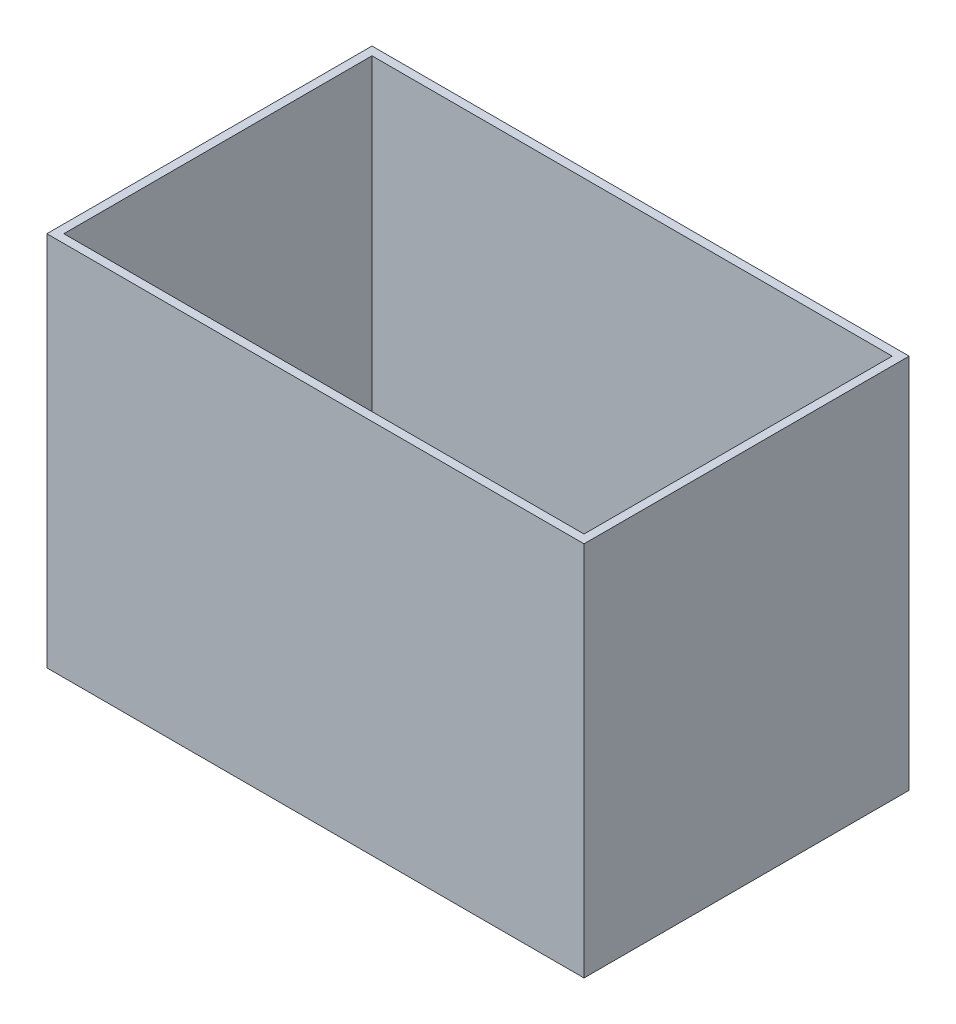
ISO-10303-21;
HEADER;
FILE_DESCRIPTION(('STEP AP214'),'2;1');
FILE_NAME('part.step','',(''),(''),'','','');
FILE_SCHEMA(('AUTOMOTIVE_DESIGN { 1 0 10303 214 1 1 1 1 }'));
ENDSEC;
DATA;
#1=APPLICATION_CONTEXT('core data for automotive mechanical design processes');
#2=APPLICATION_PROTOCOL_DEFINITION('international standard','automotive_design',2000,#1);
#3=PRODUCT_CONTEXT('',#1,'mechanical');
#4=PRODUCT('Part','Part','',(#3));
#5=PRODUCT_RELATED_PRODUCT_CATEGORY('part','',(#4));
#6=PRODUCT_DEFINITION_FORMATION('','',#4);
#7=PRODUCT_DEFINITION_CONTEXT('part definition',#1,'design');
#8=PRODUCT_DEFINITION('design','',#6,#7);
#9=PRODUCT_DEFINITION_SHAPE('','',#8);
#10=(LENGTH_UNIT() NAMED_UNIT(*) SI_UNIT(.MILLI.,.METRE.));
#11=(NAMED_UNIT(*) PLANE_ANGLE_UNIT() SI_UNIT($,.RADIAN.));
#12=(NAMED_UNIT(*) SI_UNIT($,.STERADIAN.) SOLID_ANGLE_UNIT());
#13=UNCERTAINTY_MEASURE_WITH_UNIT(LENGTH_MEASURE(1.E-05),#10,'distance_accuracy_value','');
#14=(GEOMETRIC_REPRESENTATION_CONTEXT(3) GLOBAL_UNCERTAINTY_ASSIGNED_CONTEXT((#13)) GLOBAL_UNIT_ASSIGNED_CONTEXT((#10,
#11,#12)) REPRESENTATION_CONTEXT('',''));
#15=CARTESIAN_POINT('',(0.,0.,0.));
#16=DIRECTION('',(0.,0.,1.));
#17=DIRECTION('',(1.,0.,0.));
#18=AXIS2_PLACEMENT_3D('',#15,#16,#17);
#19=CARTESIAN_POINT('',(0.,6.,0.));
#20=DIRECTION('',(1.,0.,0.));
#21=DIRECTION('',(0.,0.,-1.));
#22=AXIS2_PLACEMENT_3D('',#19,#20,#21);
#23=PLANE('',#22);
#24=DIRECTION('',(0.,0.,1.));
#25=VECTOR('',#24,1.);
#26=CARTESIAN_POINT('',(0.,0.,0.));
#27=LINE('',#26,#25);
#28=CARTESIAN_POINT('',(0.,0.,0.));
#29=VERTEX_POINT('',#28);
#30=CARTESIAN_POINT('',(0.,0.,230.));
#31=VERTEX_POINT('',#30);
#32=EDGE_CURVE('E144',#29,#31,#27,.T.);
#33=ORIENTED_EDGE('',*,*,#32,.T.);
#34=DIRECTION('',(0.,-1.,0.));
#35=VECTOR('',#34,1.);
#36=CARTESIAN_POINT('',(0.,6.,230.));
#37=LINE('',#36,#35);
#38=CARTESIAN_POINT('',(0.,266.,230.));
#39=VERTEX_POINT('',#38);
#40=EDGE_CURVE('E11',#39,#31,#37,.T.);
#41=ORIENTED_EDGE('',*,*,#40,.F.);
#42=DIRECTION('',(0.,0.,1.));
#43=VECTOR('',#42,1.);
#44=CARTESIAN_POINT('',(0.,266.,230.));
#45=LINE('',#44,#43);
#46=CARTESIAN_POINT('',(0.,266.,0.));
#47=VERTEX_POINT('',#46);
#48=EDGE_CURVE('E111',#47,#39,#45,.T.);
#49=ORIENTED_EDGE('',*,*,#48,.F.);
#50=DIRECTION('',(0.,-1.,0.));
#51=VECTOR('',#50,1.);
#52=CARTESIAN_POINT('',(0.,6.,0.));
#53=LINE('',#52,#51);
#54=EDGE_CURVE('E153',#47,#29,#53,.T.);
#55=ORIENTED_EDGE('',*,*,#54,.T.);
#56=EDGE_LOOP('',(#33,#41,#49,#55));
#57=FACE_BOUND('',#56,.T.);
#58=ADVANCED_FACE('F33',(#57),#23,.F.);
#59=CARTESIAN_POINT('',(0.,6.,230.));
#60=DIRECTION('',(0.,0.,-1.));
#61=DIRECTION('',(-1.,0.,0.));
#62=AXIS2_PLACEMENT_3D('',#59,#60,#61);
#63=PLANE('',#62);
#64=DIRECTION('',(1.,0.,0.));
#65=VECTOR('',#64,1.);
#66=CARTESIAN_POINT('',(0.,0.,230.));
#67=LINE('',#66,#65);
#68=CARTESIAN_POINT('',(380.,0.,230.));
#69=VERTEX_POINT('',#68);
#70=EDGE_CURVE('E147',#31,#69,#67,.T.);
#71=ORIENTED_EDGE('',*,*,#70,.T.);
#72=DIRECTION('',(0.,-1.,0.));
#73=VECTOR('',#72,1.);
#74=CARTESIAN_POINT('',(380.,6.,230.));
#75=LINE('',#74,#73);
#76=CARTESIAN_POINT('',(380.,266.,230.));
#77=VERTEX_POINT('',#76);
#78=EDGE_CURVE('E40',#77,#69,#75,.T.);
#79=ORIENTED_EDGE('',*,*,#78,.F.);
#80=DIRECTION('',(1.,0.,0.));
#81=VECTOR('',#80,1.);
#82=CARTESIAN_POINT('',(0.,266.,230.));
#83=LINE('',#82,#81);
#84=EDGE_CURVE('E135',#39,#77,#83,.T.);
#85=ORIENTED_EDGE('',*,*,#84,.F.);
#86=ORIENTED_EDGE('',*,*,#40,.T.);
#87=EDGE_LOOP('',(#71,#79,#85,#86));
#88=FACE_BOUND('',#87,.T.);
#89=ADVANCED_FACE('F175',(#88),#63,.F.);
#90=CARTESIAN_POINT('',(380.,6.,0.));
#91=DIRECTION('',(-1.,0.,0.));
#92=DIRECTION('',(0.,0.,1.));
#93=AXIS2_PLACEMENT_3D('',#90,#91,#92);
#94=PLANE('',#93);
#95=DIRECTION('',(0.,0.,-1.));
#96=VECTOR('',#95,1.);
#97=CARTESIAN_POINT('',(380.,0.,0.));
#98=LINE('',#97,#96);
#99=CARTESIAN_POINT('',(380.,0.,0.));
#100=VERTEX_POINT('',#99);
#101=EDGE_CURVE('E149',#69,#100,#98,.T.);
#102=ORIENTED_EDGE('',*,*,#101,.T.);
#103=DIRECTION('',(0.,-1.,0.));
#104=VECTOR('',#103,1.);
#105=CARTESIAN_POINT('',(380.,6.,0.));
#106=LINE('',#105,#104);
#107=CARTESIAN_POINT('',(380.,266.,0.));
#108=VERTEX_POINT('',#107);
#109=EDGE_CURVE('E156',#108,#100,#106,.T.);
#110=ORIENTED_EDGE('',*,*,#109,.F.);
#111=DIRECTION('',(0.,0.,-1.));
#112=VECTOR('',#111,1.);
#113=CARTESIAN_POINT('',(380.,266.,230.));
#114=LINE('',#113,#112);
#115=EDGE_CURVE('E138',#77,#108,#114,.T.);
#116=ORIENTED_EDGE('',*,*,#115,.F.);
#117=ORIENTED_EDGE('',*,*,#78,.T.);
#118=EDGE_LOOP('',(#102,#110,#116,#117));
#119=FACE_BOUND('',#118,.T.);
#120=ADVANCED_FACE('F162',(#119),#94,.F.);
#121=CARTESIAN_POINT('',(0.,6.,0.));
#122=DIRECTION('',(0.,0.,1.));
#123=DIRECTION('',(1.,0.,0.));
#124=AXIS2_PLACEMENT_3D('',#121,#122,#123);
#125=PLANE('',#124);
#126=DIRECTION('',(-1.,0.,0.));
#127=VECTOR('',#126,1.);
#128=CARTESIAN_POINT('',(0.,0.,0.));
#129=LINE('',#128,#127);
#130=EDGE_CURVE('E151',#100,#29,#129,.T.);
#131=ORIENTED_EDGE('',*,*,#130,.T.);
#132=ORIENTED_EDGE('',*,*,#54,.F.);
#133=DIRECTION('',(-1.,0.,0.));
#134=VECTOR('',#133,1.);
#135=CARTESIAN_POINT('',(0.,266.,0.));
#136=LINE('',#135,#134);
#137=EDGE_CURVE('E141',#108,#47,#136,.T.);
#138=ORIENTED_EDGE('',*,*,#137,.F.);
#139=ORIENTED_EDGE('',*,*,#109,.T.);
#140=EDGE_LOOP('',(#131,#132,#138,#139));
#141=FACE_BOUND('',#140,.T.);
#142=ADVANCED_FACE('F170',(#141),#125,.F.);
#143=CARTESIAN_POINT('',(0.,0.,0.));
#144=DIRECTION('',(0.,1.,0.));
#145=DIRECTION('',(0.,0.,1.));
#146=AXIS2_PLACEMENT_3D('',#143,#144,#145);
#147=PLANE('',#146);
#148=ORIENTED_EDGE('',*,*,#32,.F.);
#149=ORIENTED_EDGE('',*,*,#130,.F.);
#150=ORIENTED_EDGE('',*,*,#101,.F.);
#151=ORIENTED_EDGE('',*,*,#70,.F.);
#152=EDGE_LOOP('',(#148,#149,#150,#151));
#153=FACE_BOUND('',#152,.T.);
#154=ADVANCED_FACE('F168',(#153),#147,.F.);
#155=CARTESIAN_POINT('',(0.,266.,0.));
#156=DIRECTION('',(0.,-1.,0.));
#157=DIRECTION('',(0.,0.,-1.));
#158=AXIS2_PLACEMENT_3D('',#155,#156,#157);
#159=PLANE('',#158);
#160=ORIENTED_EDGE('',*,*,#48,.T.);
#161=ORIENTED_EDGE('',*,*,#84,.T.);
#162=ORIENTED_EDGE('',*,*,#115,.T.);
#163=ORIENTED_EDGE('',*,*,#137,.T.);
#164=EDGE_LOOP('',(#160,#161,#162,#163));
#165=FACE_BOUND('',#164,.T.);
#166=DIRECTION('',(1.,0.,0.));
#167=VECTOR('',#166,1.);
#168=CARTESIAN_POINT('',(6.00000000000003,266.,224.));
#169=LINE('',#168,#167);
#170=CARTESIAN_POINT('',(6.00000000000003,266.,224.));
#171=VERTEX_POINT('',#170);
#172=CARTESIAN_POINT('',(374.,266.,224.));
#173=VERTEX_POINT('',#172);
#174=EDGE_CURVE('E96',#171,#173,#169,.T.);
#175=ORIENTED_EDGE('',*,*,#174,.F.);
#176=DIRECTION('',(0.,0.,1.));
#177=VECTOR('',#176,1.);
#178=CARTESIAN_POINT('',(6.00000000000003,266.,224.));
#179=LINE('',#178,#177);
#180=CARTESIAN_POINT('',(6.00000000000003,266.,6.));
#181=VERTEX_POINT('',#180);
#182=EDGE_CURVE('E119',#181,#171,#179,.T.);
#183=ORIENTED_EDGE('',*,*,#182,.F.);
#184=DIRECTION('',(-1.,0.,0.));
#185=VECTOR('',#184,1.);
#186=CARTESIAN_POINT('',(6.00000000000003,266.,6.));
#187=LINE('',#186,#185);
#188=CARTESIAN_POINT('',(374.,266.,6.00000000000001));
#189=VERTEX_POINT('',#188);
#190=EDGE_CURVE('E117',#189,#181,#187,.T.);
#191=ORIENTED_EDGE('',*,*,#190,.F.);
#192=DIRECTION('',(0.,0.,-1.));
#193=VECTOR('',#192,1.);
#194=CARTESIAN_POINT('',(374.,266.,224.));
#195=LINE('',#194,#193);
#196=EDGE_CURVE('E105',#173,#189,#195,.T.);
#197=ORIENTED_EDGE('',*,*,#196,.F.);
#198=EDGE_LOOP('',(#175,#183,#191,#197));
#199=FACE_BOUND('',#198,.T.);
#200=ADVANCED_FACE('F115',(#165,#199),#159,.F.);
#201=CARTESIAN_POINT('',(6.00000000000003,266.,224.));
#202=DIRECTION('',(0.,0.,-1.));
#203=DIRECTION('',(-1.,0.,0.));
#204=AXIS2_PLACEMENT_3D('',#201,#202,#203);
#205=PLANE('',#204);
#206=DIRECTION('',(1.,0.,0.));
#207=VECTOR('',#206,1.);
#208=CARTESIAN_POINT('',(6.00000000000003,6.,224.));
#209=LINE('',#208,#207);
#210=CARTESIAN_POINT('',(6.00000000000003,6.,224.));
#211=VERTEX_POINT('',#210);
#212=CARTESIAN_POINT('',(374.,6.,224.));
#213=VERTEX_POINT('',#212);
#214=EDGE_CURVE('E47',#211,#213,#209,.T.);
#215=ORIENTED_EDGE('',*,*,#214,.F.);
#216=DIRECTION('',(0.,-1.,0.));
#217=VECTOR('',#216,1.);
#218=CARTESIAN_POINT('',(6.00000000000003,266.,224.));
#219=LINE('',#218,#217);
#220=EDGE_CURVE('E101',#171,#211,#219,.T.);
#221=ORIENTED_EDGE('',*,*,#220,.F.);
#222=ORIENTED_EDGE('',*,*,#174,.T.);
#223=DIRECTION('',(0.,-1.,0.));
#224=VECTOR('',#223,1.);
#225=CARTESIAN_POINT('',(374.,266.,224.));
#226=LINE('',#225,#224);
#227=EDGE_CURVE('E99',#173,#213,#226,.T.);
#228=ORIENTED_EDGE('',*,*,#227,.T.);
#229=EDGE_LOOP('',(#215,#221,#222,#228));
#230=FACE_BOUND('',#229,.T.);
#231=ADVANCED_FACE('F98',(#230),#205,.T.);
#232=CARTESIAN_POINT('',(374.,266.,224.));
#233=DIRECTION('',(-1.,0.,0.));
#234=DIRECTION('',(0.,0.,1.));
#235=AXIS2_PLACEMENT_3D('',#232,#233,#234);
#236=PLANE('',#235);
#237=DIRECTION('',(0.,0.,-1.));
#238=VECTOR('',#237,1.);
#239=CARTESIAN_POINT('',(374.,6.,224.));
#240=LINE('',#239,#238);
#241=CARTESIAN_POINT('',(374.,6.,6.00000000000001));
#242=VERTEX_POINT('',#241);
#243=EDGE_CURVE('E51',#213,#242,#240,.T.);
#244=ORIENTED_EDGE('',*,*,#243,.F.);
#245=ORIENTED_EDGE('',*,*,#227,.F.);
#246=ORIENTED_EDGE('',*,*,#196,.T.);
#247=DIRECTION('',(0.,-1.,0.));
#248=VECTOR('',#247,1.);
#249=CARTESIAN_POINT('',(374.,266.,6.00000000000001));
#250=LINE('',#249,#248);
#251=EDGE_CURVE('E112',#189,#242,#250,.T.);
#252=ORIENTED_EDGE('',*,*,#251,.T.);
#253=EDGE_LOOP('',(#244,#245,#246,#252));
#254=FACE_BOUND('',#253,.T.);
#255=ADVANCED_FACE('F109',(#254),#236,.T.);
#256=CARTESIAN_POINT('',(6.00000000000003,266.,6.));
#257=DIRECTION('',(0.,0.,1.));
#258=DIRECTION('',(1.,0.,0.));
#259=AXIS2_PLACEMENT_3D('',#256,#257,#258);
#260=PLANE('',#259);
#261=DIRECTION('',(-1.,0.,0.));
#262=VECTOR('',#261,1.);
#263=CARTESIAN_POINT('',(6.00000000000003,6.,6.));
#264=LINE('',#263,#262);
#265=CARTESIAN_POINT('',(6.00000000000003,6.,6.));
#266=VERTEX_POINT('',#265);
#267=EDGE_CURVE('E125',#242,#266,#264,.T.);
#268=ORIENTED_EDGE('',*,*,#267,.F.);
#269=ORIENTED_EDGE('',*,*,#251,.F.);
#270=ORIENTED_EDGE('',*,*,#190,.T.);
#271=DIRECTION('',(0.,-1.,0.));
#272=VECTOR('',#271,1.);
#273=CARTESIAN_POINT('',(6.00000000000003,266.,6.));
#274=LINE('',#273,#272);
#275=EDGE_CURVE('E129',#181,#266,#274,.T.);
#276=ORIENTED_EDGE('',*,*,#275,.T.);
#277=EDGE_LOOP('',(#268,#269,#270,#276));
#278=FACE_BOUND('',#277,.T.);
#279=ADVANCED_FACE('F197',(#278),#260,.T.);
#280=CARTESIAN_POINT('',(6.00000000000003,266.,224.));
#281=DIRECTION('',(1.,0.,0.));
#282=DIRECTION('',(0.,0.,-1.));
#283=AXIS2_PLACEMENT_3D('',#280,#281,#282);
#284=PLANE('',#283);
#285=DIRECTION('',(0.,0.,1.));
#286=VECTOR('',#285,1.);
#287=CARTESIAN_POINT('',(6.00000000000003,6.,224.));
#288=LINE('',#287,#286);
#289=EDGE_CURVE('E106',#266,#211,#288,.T.);
#290=ORIENTED_EDGE('',*,*,#289,.F.);
#291=ORIENTED_EDGE('',*,*,#275,.F.);
#292=ORIENTED_EDGE('',*,*,#182,.T.);
#293=ORIENTED_EDGE('',*,*,#220,.T.);
#294=EDGE_LOOP('',(#290,#291,#292,#293));
#295=FACE_BOUND('',#294,.T.);
#296=ADVANCED_FACE('F190',(#295),#284,.T.);
#297=CARTESIAN_POINT('',(0.,6.,0.));
#298=DIRECTION('',(0.,1.,0.));
#299=DIRECTION('',(0.,0.,1.));
#300=AXIS2_PLACEMENT_3D('',#297,#298,#299);
#301=PLANE('',#300);
#302=ORIENTED_EDGE('',*,*,#214,.T.);
#303=ORIENTED_EDGE('',*,*,#243,.T.);
#304=ORIENTED_EDGE('',*,*,#267,.T.);
#305=ORIENTED_EDGE('',*,*,#289,.T.);
#306=EDGE_LOOP('',(#302,#303,#304,#305));
#307=FACE_BOUND('',#306,.T.);
#308=ADVANCED_FACE('F187',(#307),#301,.T.);
#309=CLOSED_SHELL('',(#58,#89,#120,#142,#154,#200,#231,#255,#279,#296,#308));
#310=MANIFOLD_SOLID_BREP('B2',#309);
#311=ADVANCED_BREP_SHAPE_REPRESENTATION('',(#18,#310),#14);
#312=SHAPE_DEFINITION_REPRESENTATION(#9,#311);
ENDSEC;
END-ISO-10303-21;
